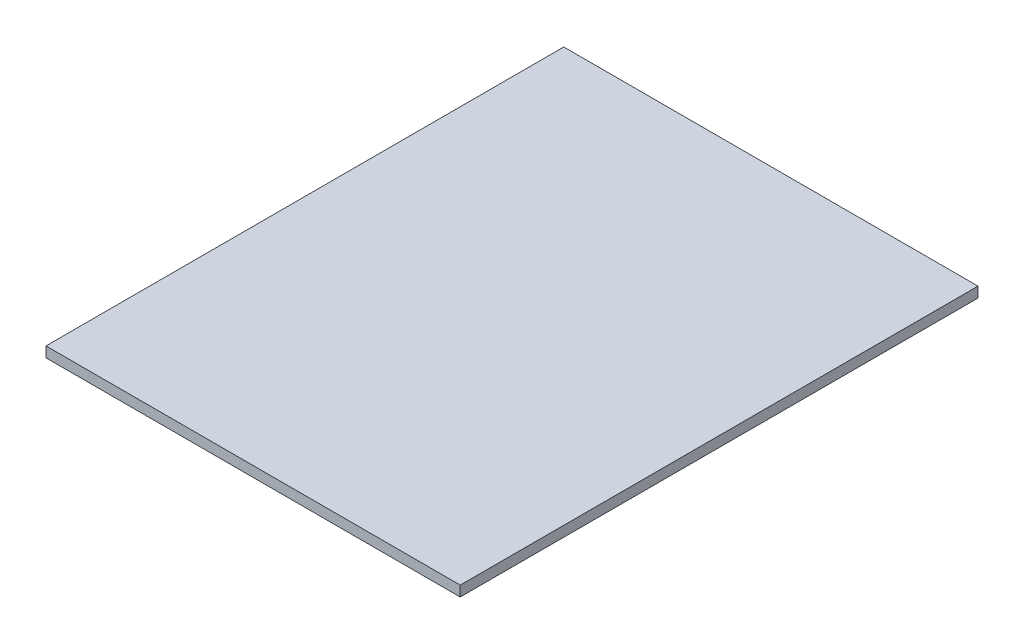
ISO-10303-21;
HEADER;
FILE_DESCRIPTION(('STEP AP214'),'2;1');
FILE_NAME('part.step','',(''),(''),'','','');
FILE_SCHEMA(('AUTOMOTIVE_DESIGN { 1 0 10303 214 1 1 1 1 }'));
ENDSEC;
DATA;
#1=APPLICATION_CONTEXT('core data for automotive mechanical design processes');
#2=APPLICATION_PROTOCOL_DEFINITION('international standard','automotive_design',2000,#1);
#3=PRODUCT_CONTEXT('',#1,'mechanical');
#4=PRODUCT('Part','Part','',(#3));
#5=PRODUCT_RELATED_PRODUCT_CATEGORY('part','',(#4));
#6=PRODUCT_DEFINITION_FORMATION('','',#4);
#7=PRODUCT_DEFINITION_CONTEXT('part definition',#1,'design');
#8=PRODUCT_DEFINITION('design','',#6,#7);
#9=PRODUCT_DEFINITION_SHAPE('','',#8);
#10=(LENGTH_UNIT() NAMED_UNIT(*) SI_UNIT(.MILLI.,.METRE.));
#11=(NAMED_UNIT(*) PLANE_ANGLE_UNIT() SI_UNIT($,.RADIAN.));
#12=(NAMED_UNIT(*) SI_UNIT($,.STERADIAN.) SOLID_ANGLE_UNIT());
#13=UNCERTAINTY_MEASURE_WITH_UNIT(LENGTH_MEASURE(1.E-05),#10,'distance_accuracy_value','');
#14=(GEOMETRIC_REPRESENTATION_CONTEXT(3) GLOBAL_UNCERTAINTY_ASSIGNED_CONTEXT((#13)) GLOBAL_UNIT_ASSIGNED_CONTEXT((#10,
#11,#12)) REPRESENTATION_CONTEXT('',''));
#15=CARTESIAN_POINT('',(0.,0.,0.));
#16=DIRECTION('',(0.,0.,1.));
#17=DIRECTION('',(1.,0.,0.));
#18=AXIS2_PLACEMENT_3D('',#15,#16,#17);
#19=CARTESIAN_POINT('',(0.,10.,0.));
#20=DIRECTION('',(1.,0.,0.));
#21=DIRECTION('',(0.,0.,-1.));
#22=AXIS2_PLACEMENT_3D('',#19,#20,#21);
#23=PLANE('',#22);
#24=DIRECTION('',(0.,0.,1.));
#25=VECTOR('',#24,1.);
#26=CARTESIAN_POINT('',(0.,0.,0.));
#27=LINE('',#26,#25);
#28=CARTESIAN_POINT('',(0.,0.,-500.));
#29=VERTEX_POINT('',#28);
#30=CARTESIAN_POINT('',(0.,0.,0.));
#31=VERTEX_POINT('',#30);
#32=EDGE_CURVE('E98',#29,#31,#27,.T.);
#33=ORIENTED_EDGE('',*,*,#32,.T.);
#34=DIRECTION('',(0.,-1.,0.));
#35=VECTOR('',#34,1.);
#36=CARTESIAN_POINT('',(0.,10.,0.));
#37=LINE('',#36,#35);
#38=CARTESIAN_POINT('',(0.,10.,0.));
#39=VERTEX_POINT('',#38);
#40=EDGE_CURVE('E11',#39,#31,#37,.T.);
#41=ORIENTED_EDGE('',*,*,#40,.F.);
#42=DIRECTION('',(0.,0.,1.));
#43=VECTOR('',#42,1.);
#44=CARTESIAN_POINT('',(0.,10.,0.));
#45=LINE('',#44,#43);
#46=CARTESIAN_POINT('',(0.,10.,-500.));
#47=VERTEX_POINT('',#46);
#48=EDGE_CURVE('E86',#47,#39,#45,.T.);
#49=ORIENTED_EDGE('',*,*,#48,.F.);
#50=DIRECTION('',(0.,-1.,0.));
#51=VECTOR('',#50,1.);
#52=CARTESIAN_POINT('',(0.,10.,-500.));
#53=LINE('',#52,#51);
#54=EDGE_CURVE('E94',#47,#29,#53,.T.);
#55=ORIENTED_EDGE('',*,*,#54,.T.);
#56=EDGE_LOOP('',(#33,#41,#49,#55));
#57=FACE_BOUND('',#56,.T.);
#58=ADVANCED_FACE('F35',(#57),#23,.F.);
#59=CARTESIAN_POINT('',(0.,10.,0.));
#60=DIRECTION('',(0.,0.,-1.));
#61=DIRECTION('',(-1.,0.,0.));
#62=AXIS2_PLACEMENT_3D('',#59,#60,#61);
#63=PLANE('',#62);
#64=DIRECTION('',(1.,0.,0.));
#65=VECTOR('',#64,1.);
#66=CARTESIAN_POINT('',(0.,0.,0.));
#67=LINE('',#66,#65);
#68=CARTESIAN_POINT('',(400.,0.,0.));
#69=VERTEX_POINT('',#68);
#70=EDGE_CURVE('E90',#31,#69,#67,.T.);
#71=ORIENTED_EDGE('',*,*,#70,.T.);
#72=DIRECTION('',(0.,-1.,0.));
#73=VECTOR('',#72,1.);
#74=CARTESIAN_POINT('',(400.,10.,0.));
#75=LINE('',#74,#73);
#76=CARTESIAN_POINT('',(400.,10.,0.));
#77=VERTEX_POINT('',#76);
#78=EDGE_CURVE('E43',#77,#69,#75,.T.);
#79=ORIENTED_EDGE('',*,*,#78,.F.);
#80=DIRECTION('',(1.,0.,0.));
#81=VECTOR('',#80,1.);
#82=CARTESIAN_POINT('',(0.,10.,0.));
#83=LINE('',#82,#81);
#84=EDGE_CURVE('E81',#39,#77,#83,.T.);
#85=ORIENTED_EDGE('',*,*,#84,.F.);
#86=ORIENTED_EDGE('',*,*,#40,.T.);
#87=EDGE_LOOP('',(#71,#79,#85,#86));
#88=FACE_BOUND('',#87,.T.);
#89=ADVANCED_FACE('F89',(#88),#63,.F.);
#90=CARTESIAN_POINT('',(400.,10.,0.));
#91=DIRECTION('',(-1.,0.,0.));
#92=DIRECTION('',(0.,0.,1.));
#93=AXIS2_PLACEMENT_3D('',#90,#91,#92);
#94=PLANE('',#93);
#95=DIRECTION('',(0.,0.,-1.));
#96=VECTOR('',#95,1.);
#97=CARTESIAN_POINT('',(400.,0.,0.));
#98=LINE('',#97,#96);
#99=CARTESIAN_POINT('',(400.,0.,-500.));
#100=VERTEX_POINT('',#99);
#101=EDGE_CURVE('E68',#69,#100,#98,.T.);
#102=ORIENTED_EDGE('',*,*,#101,.T.);
#103=DIRECTION('',(0.,-1.,0.));
#104=VECTOR('',#103,1.);
#105=CARTESIAN_POINT('',(400.,10.,-500.));
#106=LINE('',#105,#104);
#107=CARTESIAN_POINT('',(400.,10.,-500.));
#108=VERTEX_POINT('',#107);
#109=EDGE_CURVE('E91',#108,#100,#106,.T.);
#110=ORIENTED_EDGE('',*,*,#109,.F.);
#111=DIRECTION('',(0.,0.,-1.));
#112=VECTOR('',#111,1.);
#113=CARTESIAN_POINT('',(400.,10.,0.));
#114=LINE('',#113,#112);
#115=EDGE_CURVE('E84',#77,#108,#114,.T.);
#116=ORIENTED_EDGE('',*,*,#115,.F.);
#117=ORIENTED_EDGE('',*,*,#78,.T.);
#118=EDGE_LOOP('',(#102,#110,#116,#117));
#119=FACE_BOUND('',#118,.T.);
#120=ADVANCED_FACE('F92',(#119),#94,.F.);
#121=CARTESIAN_POINT('',(0.,10.,-500.));
#122=DIRECTION('',(0.,0.,1.));
#123=DIRECTION('',(1.,0.,0.));
#124=AXIS2_PLACEMENT_3D('',#121,#122,#123);
#125=PLANE('',#124);
#126=DIRECTION('',(-1.,0.,0.));
#127=VECTOR('',#126,1.);
#128=CARTESIAN_POINT('',(0.,0.,-500.));
#129=LINE('',#128,#127);
#130=EDGE_CURVE('E74',#100,#29,#129,.T.);
#131=ORIENTED_EDGE('',*,*,#130,.T.);
#132=ORIENTED_EDGE('',*,*,#54,.F.);
#133=DIRECTION('',(-1.,0.,0.));
#134=VECTOR('',#133,1.);
#135=CARTESIAN_POINT('',(0.,10.,-500.));
#136=LINE('',#135,#134);
#137=EDGE_CURVE('E51',#108,#47,#136,.T.);
#138=ORIENTED_EDGE('',*,*,#137,.F.);
#139=ORIENTED_EDGE('',*,*,#109,.T.);
#140=EDGE_LOOP('',(#131,#132,#138,#139));
#141=FACE_BOUND('',#140,.T.);
#142=ADVANCED_FACE('F105',(#141),#125,.F.);
#143=CARTESIAN_POINT('',(0.,10.,0.));
#144=DIRECTION('',(0.,-1.,0.));
#145=DIRECTION('',(0.,0.,-1.));
#146=AXIS2_PLACEMENT_3D('',#143,#144,#145);
#147=PLANE('',#146);
#148=ORIENTED_EDGE('',*,*,#48,.T.);
#149=ORIENTED_EDGE('',*,*,#84,.T.);
#150=ORIENTED_EDGE('',*,*,#115,.T.);
#151=ORIENTED_EDGE('',*,*,#137,.T.);
#152=EDGE_LOOP('',(#148,#149,#150,#151));
#153=FACE_BOUND('',#152,.T.);
#154=ADVANCED_FACE('F82',(#153),#147,.F.);
#155=CARTESIAN_POINT('',(0.,0.,0.));
#156=DIRECTION('',(0.,-1.,0.));
#157=DIRECTION('',(0.,0.,-1.));
#158=AXIS2_PLACEMENT_3D('',#155,#156,#157);
#159=PLANE('',#158);
#160=ORIENTED_EDGE('',*,*,#32,.F.);
#161=ORIENTED_EDGE('',*,*,#130,.F.);
#162=ORIENTED_EDGE('',*,*,#101,.F.);
#163=ORIENTED_EDGE('',*,*,#70,.F.);
#164=EDGE_LOOP('',(#160,#161,#162,#163));
#165=FACE_BOUND('',#164,.T.);
#166=ADVANCED_FACE('F108',(#165),#159,.T.);
#167=CLOSED_SHELL('',(#58,#89,#120,#142,#154,#166));
#168=MANIFOLD_SOLID_BREP('B2',#167);
#169=ADVANCED_BREP_SHAPE_REPRESENTATION('',(#18,#168),#14);
#170=SHAPE_DEFINITION_REPRESENTATION(#9,#169);
ENDSEC;
END-ISO-10303-21;
